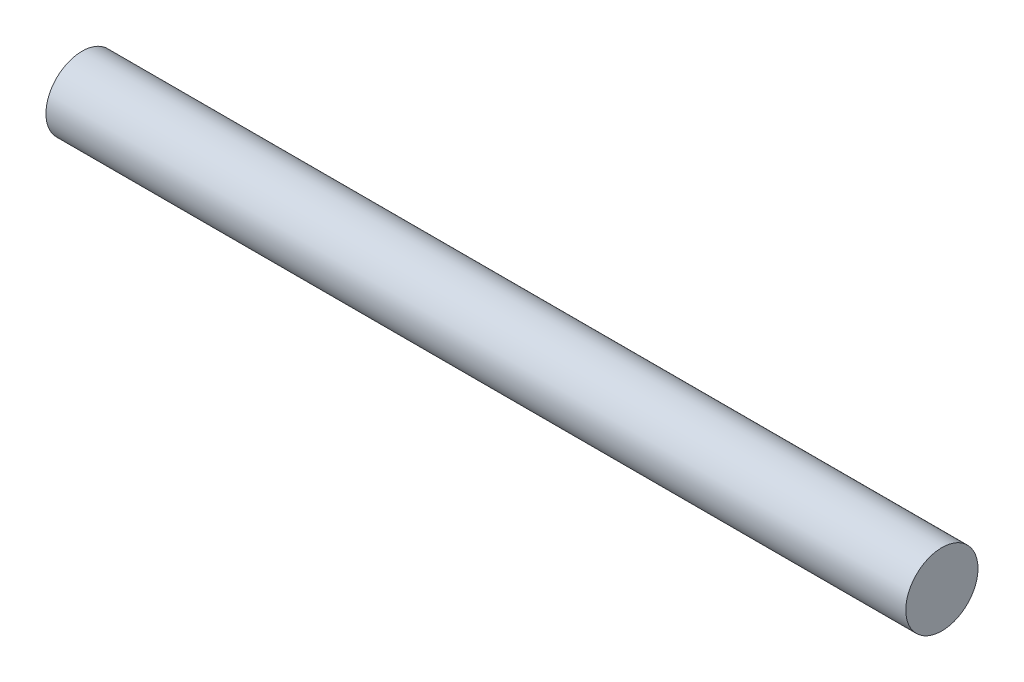
ISO-10303-21;
HEADER;
FILE_DESCRIPTION(('STEP AP214'),'2;1');
FILE_NAME('part.step','',(''),(''),'','','');
FILE_SCHEMA(('AUTOMOTIVE_DESIGN { 1 0 10303 214 1 1 1 1 }'));
ENDSEC;
DATA;
#1=APPLICATION_CONTEXT('core data for automotive mechanical design processes');
#2=APPLICATION_PROTOCOL_DEFINITION('international standard','automotive_design',2000,#1);
#3=PRODUCT_CONTEXT('',#1,'mechanical');
#4=PRODUCT('Part','Part','',(#3));
#5=PRODUCT_RELATED_PRODUCT_CATEGORY('part','',(#4));
#6=PRODUCT_DEFINITION_FORMATION('','',#4);
#7=PRODUCT_DEFINITION_CONTEXT('part definition',#1,'design');
#8=PRODUCT_DEFINITION('design','',#6,#7);
#9=PRODUCT_DEFINITION_SHAPE('','',#8);
#10=(LENGTH_UNIT() NAMED_UNIT(*) SI_UNIT(.MILLI.,.METRE.));
#11=(NAMED_UNIT(*) PLANE_ANGLE_UNIT() SI_UNIT($,.RADIAN.));
#12=(NAMED_UNIT(*) SI_UNIT($,.STERADIAN.) SOLID_ANGLE_UNIT());
#13=UNCERTAINTY_MEASURE_WITH_UNIT(LENGTH_MEASURE(1.E-05),#10,'distance_accuracy_value','');
#14=(GEOMETRIC_REPRESENTATION_CONTEXT(3) GLOBAL_UNCERTAINTY_ASSIGNED_CONTEXT((#13)) GLOBAL_UNIT_ASSIGNED_CONTEXT((#10,
#11,#12)) REPRESENTATION_CONTEXT('',''));
#15=CARTESIAN_POINT('',(0.,0.,0.));
#16=DIRECTION('',(0.,0.,1.));
#17=DIRECTION('',(1.,0.,0.));
#18=AXIS2_PLACEMENT_3D('',#15,#16,#17);
#19=CARTESIAN_POINT('',(2000.,0.,0.));
#20=DIRECTION('',(1.,0.,0.));
#21=DIRECTION('',(0.,0.,-1.));
#22=AXIS2_PLACEMENT_3D('',#19,#20,#21);
#23=PLANE('',#22);
#24=CARTESIAN_POINT('',(2000.,0.,0.));
#25=DIRECTION('',(1.,0.,0.));
#26=DIRECTION('',(0.,0.,-1.));
#27=AXIS2_PLACEMENT_3D('',#24,#25,#26);
#28=CIRCLE('',#27,84.);
#29=CARTESIAN_POINT('',(2000.,0.,-84.));
#30=VERTEX_POINT('',#29);
#31=EDGE_CURVE('E10',#30,#30,#28,.T.);
#32=ORIENTED_EDGE('',*,*,#31,.T.);
#33=EDGE_LOOP('',(#32));
#34=FACE_BOUND('',#33,.T.);
#35=ADVANCED_FACE('F40',(#34),#23,.T.);
#36=CARTESIAN_POINT('',(0.,0.,0.));
#37=DIRECTION('',(1.,0.,0.));
#38=DIRECTION('',(0.,0.,-1.));
#39=AXIS2_PLACEMENT_3D('',#36,#37,#38);
#40=PLANE('',#39);
#41=CARTESIAN_POINT('',(0.,0.,0.));
#42=DIRECTION('',(1.,0.,0.));
#43=DIRECTION('',(0.,0.,-1.));
#44=AXIS2_PLACEMENT_3D('',#41,#42,#43);
#45=CIRCLE('',#44,84.);
#46=CARTESIAN_POINT('',(0.,0.,-84.));
#47=VERTEX_POINT('',#46);
#48=EDGE_CURVE('E50',#47,#47,#45,.T.);
#49=ORIENTED_EDGE('',*,*,#48,.F.);
#50=EDGE_LOOP('',(#49));
#51=FACE_BOUND('',#50,.T.);
#52=ADVANCED_FACE('F81',(#51),#40,.F.);
#53=CARTESIAN_POINT('',(2000.,0.,0.));
#54=DIRECTION('',(-1.,0.,0.));
#55=DIRECTION('',(0.,0.,1.));
#56=AXIS2_PLACEMENT_3D('',#53,#54,#55);
#57=CYLINDRICAL_SURFACE('',#56,84.);
#58=ORIENTED_EDGE('',*,*,#31,.F.);
#59=EDGE_LOOP('',(#58));
#60=FACE_BOUND('',#59,.T.);
#61=ORIENTED_EDGE('',*,*,#48,.T.);
#62=EDGE_LOOP('',(#61));
#63=FACE_BOUND('',#62,.T.);
#64=ADVANCED_FACE('F42',(#60,#63),#57,.T.);
#65=CLOSED_SHELL('',(#35,#52,#64));
#66=CARTESIAN_POINT('',(10.,0.,0.));
#67=DIRECTION('',(-1.,0.,0.));
#68=DIRECTION('',(0.,0.,1.));
#69=AXIS2_PLACEMENT_3D('',#66,#67,#68);
#70=PLANE('',#69);
#71=CARTESIAN_POINT('',(10.,0.,0.));
#72=DIRECTION('',(-1.,0.,0.));
#73=DIRECTION('',(0.,0.,1.));
#74=AXIS2_PLACEMENT_3D('',#71,#72,#73);
#75=CIRCLE('',#74,79.);
#76=CARTESIAN_POINT('',(10.,0.,79.));
#77=VERTEX_POINT('',#76);
#78=EDGE_CURVE('E44',#77,#77,#75,.T.);
#79=ORIENTED_EDGE('',*,*,#78,.F.);
#80=EDGE_LOOP('',(#79));
#81=FACE_BOUND('',#80,.T.);
#82=ADVANCED_FACE('F68',(#81),#70,.F.);
#83=CARTESIAN_POINT('',(2000.,0.,0.));
#84=DIRECTION('',(-1.,0.,0.));
#85=DIRECTION('',(0.,0.,1.));
#86=AXIS2_PLACEMENT_3D('',#83,#84,#85);
#87=CYLINDRICAL_SURFACE('',#86,79.);
#88=ORIENTED_EDGE('',*,*,#78,.T.);
#89=EDGE_LOOP('',(#88));
#90=FACE_BOUND('',#89,.T.);
#91=CARTESIAN_POINT('',(1990.,0.,0.));
#92=DIRECTION('',(1.,0.,0.));
#93=DIRECTION('',(0.,0.,-1.));
#94=AXIS2_PLACEMENT_3D('',#91,#92,#93);
#95=CIRCLE('',#94,79.);
#96=CARTESIAN_POINT('',(1990.,0.,-79.));
#97=VERTEX_POINT('',#96);
#98=EDGE_CURVE('E57',#97,#97,#95,.T.);
#99=ORIENTED_EDGE('',*,*,#98,.T.);
#100=EDGE_LOOP('',(#99));
#101=FACE_BOUND('',#100,.T.);
#102=ADVANCED_FACE('F66',(#90,#101),#87,.F.);
#103=CARTESIAN_POINT('',(1990.,0.,0.));
#104=DIRECTION('',(1.,0.,0.));
#105=DIRECTION('',(0.,0.,-1.));
#106=AXIS2_PLACEMENT_3D('',#103,#104,#105);
#107=PLANE('',#106);
#108=ORIENTED_EDGE('',*,*,#98,.F.);
#109=EDGE_LOOP('',(#108));
#110=FACE_BOUND('',#109,.T.);
#111=ADVANCED_FACE('F76',(#110),#107,.F.);
#112=CLOSED_SHELL('',(#82,#102,#111));
#113=ORIENTED_CLOSED_SHELL('',*,#112,.T.);
#114=BREP_WITH_VOIDS('B2',#65,(#113));
#115=ADVANCED_BREP_SHAPE_REPRESENTATION('',(#18,#114),#14);
#116=SHAPE_DEFINITION_REPRESENTATION(#9,#115);
ENDSEC;
END-ISO-10303-21;
